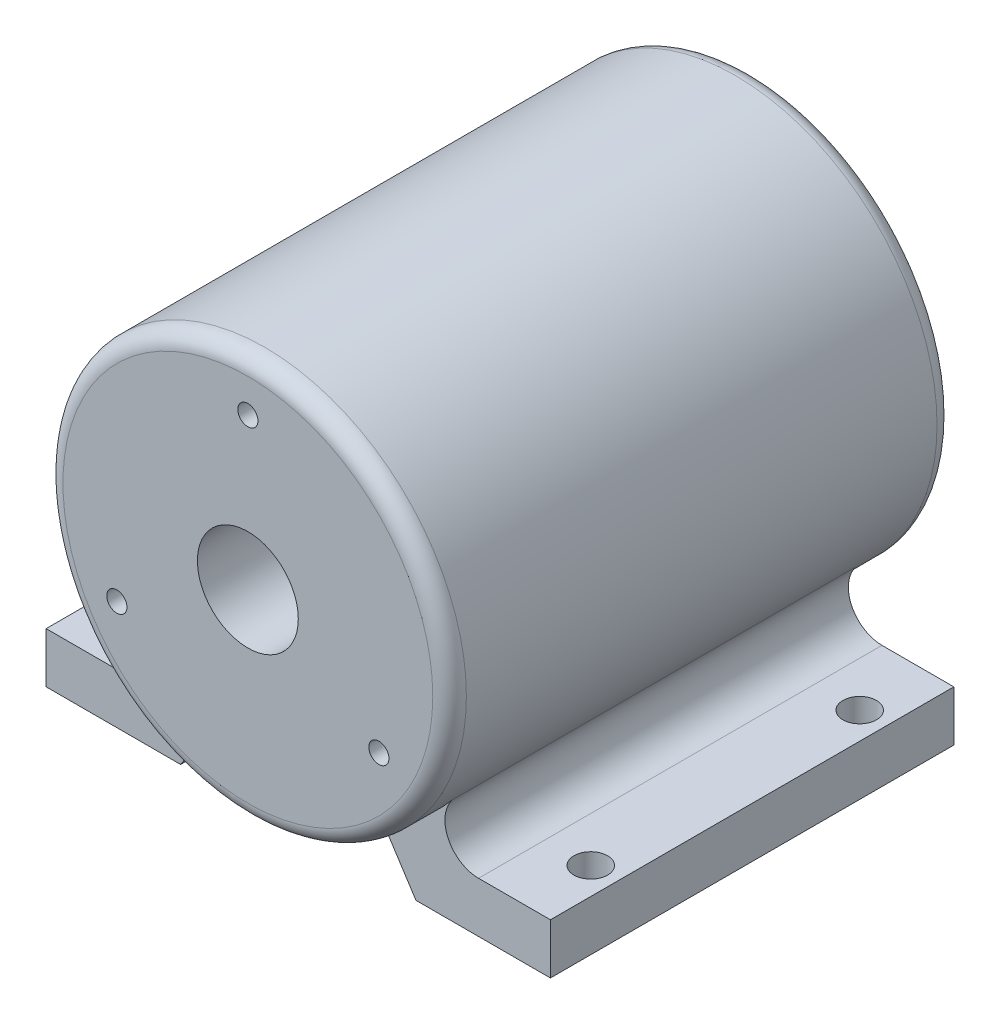
ISO-10303-21;
HEADER;
FILE_DESCRIPTION(('STEP AP214'),'2;1');
FILE_NAME('part.step','',(''),(''),'','','');
FILE_SCHEMA(('AUTOMOTIVE_DESIGN { 1 0 10303 214 1 1 1 1 }'));
ENDSEC;
DATA;
#1=APPLICATION_CONTEXT('core data for automotive mechanical design processes');
#2=APPLICATION_PROTOCOL_DEFINITION('international standard','automotive_design',2000,#1);
#3=PRODUCT_CONTEXT('',#1,'mechanical');
#4=PRODUCT('Part','Part','',(#3));
#5=PRODUCT_RELATED_PRODUCT_CATEGORY('part','',(#4));
#6=PRODUCT_DEFINITION_FORMATION('','',#4);
#7=PRODUCT_DEFINITION_CONTEXT('part definition',#1,'design');
#8=PRODUCT_DEFINITION('design','',#6,#7);
#9=PRODUCT_DEFINITION_SHAPE('','',#8);
#10=(LENGTH_UNIT() NAMED_UNIT(*) SI_UNIT(.MILLI.,.METRE.));
#11=(NAMED_UNIT(*) PLANE_ANGLE_UNIT() SI_UNIT($,.RADIAN.));
#12=(NAMED_UNIT(*) SI_UNIT($,.STERADIAN.) SOLID_ANGLE_UNIT());
#13=UNCERTAINTY_MEASURE_WITH_UNIT(LENGTH_MEASURE(1.E-05),#10,'distance_accuracy_value','');
#14=(GEOMETRIC_REPRESENTATION_CONTEXT(3) GLOBAL_UNCERTAINTY_ASSIGNED_CONTEXT((#13)) GLOBAL_UNIT_ASSIGNED_CONTEXT((#10,
#11,#12)) REPRESENTATION_CONTEXT('',''));
#15=CARTESIAN_POINT('',(0.,0.,0.));
#16=DIRECTION('',(0.,0.,1.));
#17=DIRECTION('',(1.,0.,0.));
#18=AXIS2_PLACEMENT_3D('',#15,#16,#17);
#19=CARTESIAN_POINT('',(0.,-5.5,13.5));
#20=DIRECTION('',(0.,-1.,0.));
#21=DIRECTION('',(1.,0.,0.));
#22=AXIS2_PLACEMENT_3D('',#19,#20,#21);
#23=PLANE('',#22);
#24=CARTESIAN_POINT('',(6.7,-5.5,11.5));
#25=DIRECTION('',(0.,1.,0.));
#26=DIRECTION('',(0.,0.,1.));
#27=AXIS2_PLACEMENT_3D('',#24,#25,#26);
#28=CIRCLE('',#27,0.5);
#29=CARTESIAN_POINT('',(6.7,-5.5,12.));
#30=VERTEX_POINT('',#29);
#31=EDGE_CURVE('E223',#30,#30,#28,.T.);
#32=ORIENTED_EDGE('',*,*,#31,.F.);
#33=EDGE_LOOP('',(#32));
#34=FACE_BOUND('',#33,.T.);
#35=DIRECTION('',(-1.,0.,0.));
#36=VECTOR('',#35,1.);
#37=CARTESIAN_POINT('',(0.,-5.5,1.5));
#38=LINE('',#37,#36);
#39=CARTESIAN_POINT('',(7.5,-5.5,1.5));
#40=VERTEX_POINT('',#39);
#41=CARTESIAN_POINT('',(5.36190264738181,-5.5,1.5));
#42=VERTEX_POINT('',#41);
#43=EDGE_CURVE('E254',#40,#42,#38,.T.);
#44=ORIENTED_EDGE('',*,*,#43,.T.);
#45=DIRECTION('',(0.,0.,-1.));
#46=VECTOR('',#45,1.);
#47=CARTESIAN_POINT('',(5.36190264738181,-5.5,13.5));
#48=LINE('',#47,#46);
#49=CARTESIAN_POINT('',(5.36190264738181,-5.5,13.5));
#50=VERTEX_POINT('',#49);
#51=EDGE_CURVE('E266',#50,#42,#48,.T.);
#52=ORIENTED_EDGE('',*,*,#51,.F.);
#53=DIRECTION('',(-1.,0.,0.));
#54=VECTOR('',#53,1.);
#55=CARTESIAN_POINT('',(0.,-5.5,13.5));
#56=LINE('',#55,#54);
#57=CARTESIAN_POINT('',(7.5,-5.5,13.5));
#58=VERTEX_POINT('',#57);
#59=EDGE_CURVE('E239',#58,#50,#56,.T.);
#60=ORIENTED_EDGE('',*,*,#59,.F.);
#61=DIRECTION('',(0.,0.,-1.));
#62=VECTOR('',#61,1.);
#63=CARTESIAN_POINT('',(7.5,-5.5,13.5));
#64=LINE('',#63,#62);
#65=EDGE_CURVE('E268',#58,#40,#64,.T.);
#66=ORIENTED_EDGE('',*,*,#65,.T.);
#67=EDGE_LOOP('',(#44,#52,#60,#66));
#68=FACE_BOUND('',#67,.T.);
#69=CARTESIAN_POINT('',(6.7,-5.5,3.5));
#70=DIRECTION('',(0.,1.,0.));
#71=DIRECTION('',(0.,0.,1.));
#72=AXIS2_PLACEMENT_3D('',#69,#70,#71);
#73=CIRCLE('',#72,0.5);
#74=CARTESIAN_POINT('',(6.7,-5.5,4.));
#75=VERTEX_POINT('',#74);
#76=EDGE_CURVE('E217',#75,#75,#73,.T.);
#77=ORIENTED_EDGE('',*,*,#76,.F.);
#78=EDGE_LOOP('',(#77));
#79=FACE_BOUND('',#78,.T.);
#80=ADVANCED_FACE('F37',(#34,#68,#79),#23,.F.);
#81=CARTESIAN_POINT('',(0.,0.,15.));
#82=DIRECTION('',(0.,0.,-1.));
#83=DIRECTION('',(-1.,0.,0.));
#84=AXIS2_PLACEMENT_3D('',#81,#82,#83);
#85=CYLINDRICAL_SURFACE('',#84,6.);
#86=DIRECTION('',(0.,0.,-1.));
#87=VECTOR('',#86,1.);
#88=CARTESIAN_POINT('',(-4.59591655489869,-3.85714285714285,13.5));
#89=LINE('',#88,#87);
#90=CARTESIAN_POINT('',(-4.59591655489869,-3.85714285714285,13.5));
#91=VERTEX_POINT('',#90);
#92=CARTESIAN_POINT('',(-4.59591655489869,-3.85714285714285,1.5));
#93=VERTEX_POINT('',#92);
#94=EDGE_CURVE('E57',#91,#93,#89,.T.);
#95=ORIENTED_EDGE('',*,*,#94,.F.);
#96=CARTESIAN_POINT('',(0.,0.,13.5));
#97=DIRECTION('',(0.,0.,-1.));
#98=DIRECTION('',(-1.,0.,0.));
#99=AXIS2_PLACEMENT_3D('',#96,#97,#98);
#100=CIRCLE('',#99,6.);
#101=CARTESIAN_POINT('',(-2.5,-5.45435605731786,13.5));
#102=VERTEX_POINT('',#101);
#103=EDGE_CURVE('E52',#102,#91,#100,.T.);
#104=ORIENTED_EDGE('',*,*,#103,.F.);
#105=DIRECTION('',(0.,0.,-1.));
#106=VECTOR('',#105,1.);
#107=CARTESIAN_POINT('',(-2.5,-5.45435605731786,13.5));
#108=LINE('',#107,#106);
#109=CARTESIAN_POINT('',(-2.5,-5.45435605731786,1.5));
#110=VERTEX_POINT('',#109);
#111=EDGE_CURVE('E215',#102,#110,#108,.T.);
#112=ORIENTED_EDGE('',*,*,#111,.T.);
#113=CARTESIAN_POINT('',(0.,0.,1.5));
#114=DIRECTION('',(0.,0.,-1.));
#115=DIRECTION('',(-1.,0.,0.));
#116=AXIS2_PLACEMENT_3D('',#113,#114,#115);
#117=CIRCLE('',#116,6.);
#118=EDGE_CURVE('E194',#110,#93,#117,.T.);
#119=ORIENTED_EDGE('',*,*,#118,.T.);
#120=EDGE_LOOP('',(#95,#104,#112,#119));
#121=FACE_BOUND('',#120,.T.);
#122=DIRECTION('',(0.,0.,-1.));
#123=VECTOR('',#122,1.);
#124=CARTESIAN_POINT('',(2.5,-5.45435605731786,13.5));
#125=LINE('',#124,#123);
#126=CARTESIAN_POINT('',(2.5,-5.45435605731786,13.5));
#127=VERTEX_POINT('',#126);
#128=CARTESIAN_POINT('',(2.5,-5.45435605731786,1.5));
#129=VERTEX_POINT('',#128);
#130=EDGE_CURVE('E246',#127,#129,#125,.T.);
#131=ORIENTED_EDGE('',*,*,#130,.F.);
#132=CARTESIAN_POINT('',(0.,0.,13.5));
#133=DIRECTION('',(0.,0.,1.));
#134=DIRECTION('',(1.,0.,0.));
#135=AXIS2_PLACEMENT_3D('',#132,#133,#134);
#136=CIRCLE('',#135,6.);
#137=CARTESIAN_POINT('',(4.59591655489869,-3.85714285714285,13.5));
#138=VERTEX_POINT('',#137);
#139=EDGE_CURVE('E244',#127,#138,#136,.T.);
#140=ORIENTED_EDGE('',*,*,#139,.T.);
#141=DIRECTION('',(0.,0.,-1.));
#142=VECTOR('',#141,1.);
#143=CARTESIAN_POINT('',(4.59591655489869,-3.85714285714285,13.5));
#144=LINE('',#143,#142);
#145=CARTESIAN_POINT('',(4.59591655489869,-3.85714285714285,1.5));
#146=VERTEX_POINT('',#145);
#147=EDGE_CURVE('E264',#138,#146,#144,.T.);
#148=ORIENTED_EDGE('',*,*,#147,.T.);
#149=CARTESIAN_POINT('',(0.,0.,1.5));
#150=DIRECTION('',(0.,0.,1.));
#151=DIRECTION('',(1.,0.,0.));
#152=AXIS2_PLACEMENT_3D('',#149,#150,#151);
#153=CIRCLE('',#152,6.);
#154=EDGE_CURVE('E234',#129,#146,#153,.T.);
#155=ORIENTED_EDGE('',*,*,#154,.F.);
#156=EDGE_LOOP('',(#131,#140,#148,#155));
#157=FACE_BOUND('',#156,.T.);
#158=CARTESIAN_POINT('',(0.,0.,14.5));
#159=DIRECTION('',(0.,0.,1.));
#160=DIRECTION('',(1.,0.,0.));
#161=AXIS2_PLACEMENT_3D('',#158,#159,#160);
#162=CIRCLE('',#161,6.);
#163=CARTESIAN_POINT('',(6.,0.,14.5));
#164=VERTEX_POINT('',#163);
#165=EDGE_CURVE('E281',#164,#164,#162,.F.);
#166=ORIENTED_EDGE('',*,*,#165,.T.);
#167=EDGE_LOOP('',(#166));
#168=FACE_BOUND('',#167,.T.);
#169=CARTESIAN_POINT('',(0.,0.,0.5));
#170=DIRECTION('',(0.,0.,1.));
#171=DIRECTION('',(1.,0.,0.));
#172=AXIS2_PLACEMENT_3D('',#169,#170,#171);
#173=CIRCLE('',#172,6.);
#174=CARTESIAN_POINT('',(6.,0.,0.5));
#175=VERTEX_POINT('',#174);
#176=EDGE_CURVE('E278',#175,#175,#173,.T.);
#177=ORIENTED_EDGE('',*,*,#176,.T.);
#178=EDGE_LOOP('',(#177));
#179=FACE_BOUND('',#178,.T.);
#180=ADVANCED_FACE('F328',(#121,#157,#168,#179),#85,.T.);
#181=CARTESIAN_POINT('',(0.,0.,15.));
#182=DIRECTION('',(0.,0.,1.));
#183=DIRECTION('',(1.,0.,0.));
#184=AXIS2_PLACEMENT_3D('',#181,#182,#183);
#185=PLANE('',#184);
#186=CARTESIAN_POINT('',(0.,4.5,15.));
#187=DIRECTION('',(0.,0.,1.));
#188=DIRECTION('',(1.,0.,0.));
#189=AXIS2_PLACEMENT_3D('',#186,#187,#188);
#190=CIRCLE('',#189,0.299999999999989);
#191=CARTESIAN_POINT('',(0.299999999999989,4.5,15.));
#192=VERTEX_POINT('',#191);
#193=EDGE_CURVE('E142',#192,#192,#190,.T.);
#194=ORIENTED_EDGE('',*,*,#193,.F.);
#195=EDGE_LOOP('',(#194));
#196=FACE_BOUND('',#195,.T.);
#197=CARTESIAN_POINT('',(3.89711431702997,-2.25,15.));
#198=DIRECTION('',(0.,0.,1.));
#199=DIRECTION('',(1.,0.,0.));
#200=AXIS2_PLACEMENT_3D('',#197,#198,#199);
#201=CIRCLE('',#200,0.299999999999989);
#202=CARTESIAN_POINT('',(4.19711431702996,-2.25,15.));
#203=VERTEX_POINT('',#202);
#204=EDGE_CURVE('E141',#203,#203,#201,.T.);
#205=ORIENTED_EDGE('',*,*,#204,.F.);
#206=EDGE_LOOP('',(#205));
#207=FACE_BOUND('',#206,.T.);
#208=CARTESIAN_POINT('',(-3.89711431702997,-2.25,15.));
#209=DIRECTION('',(0.,0.,1.));
#210=DIRECTION('',(1.,0.,0.));
#211=AXIS2_PLACEMENT_3D('',#208,#209,#210);
#212=CIRCLE('',#211,0.299999999999989);
#213=CARTESIAN_POINT('',(-3.59711431702998,-2.25,15.));
#214=VERTEX_POINT('',#213);
#215=EDGE_CURVE('E152',#214,#214,#212,.T.);
#216=ORIENTED_EDGE('',*,*,#215,.F.);
#217=EDGE_LOOP('',(#216));
#218=FACE_BOUND('',#217,.T.);
#219=CARTESIAN_POINT('',(0.,0.,15.));
#220=DIRECTION('',(0.,0.,1.));
#221=DIRECTION('',(1.,0.,0.));
#222=AXIS2_PLACEMENT_3D('',#219,#220,#221);
#223=CIRCLE('',#222,1.5);
#224=CARTESIAN_POINT('',(1.5,0.,15.));
#225=VERTEX_POINT('',#224);
#226=EDGE_CURVE('E158',#225,#225,#223,.T.);
#227=ORIENTED_EDGE('',*,*,#226,.F.);
#228=EDGE_LOOP('',(#227));
#229=FACE_BOUND('',#228,.T.);
#230=CARTESIAN_POINT('',(0.,0.,15.));
#231=DIRECTION('',(0.,0.,1.));
#232=DIRECTION('',(1.,0.,0.));
#233=AXIS2_PLACEMENT_3D('',#230,#231,#232);
#234=CIRCLE('',#233,5.5);
#235=CARTESIAN_POINT('',(5.5,0.,15.));
#236=VERTEX_POINT('',#235);
#237=EDGE_CURVE('E275',#236,#236,#234,.T.);
#238=ORIENTED_EDGE('',*,*,#237,.T.);
#239=EDGE_LOOP('',(#238));
#240=FACE_BOUND('',#239,.T.);
#241=ADVANCED_FACE('F334',(#196,#207,#218,#229,#240),#185,.T.);
#242=CARTESIAN_POINT('',(0.,0.,0.));
#243=DIRECTION('',(0.,0.,1.));
#244=DIRECTION('',(1.,0.,0.));
#245=AXIS2_PLACEMENT_3D('',#242,#243,#244);
#246=PLANE('',#245);
#247=CARTESIAN_POINT('',(0.,0.,0.));
#248=DIRECTION('',(0.,0.,1.));
#249=DIRECTION('',(1.,0.,0.));
#250=AXIS2_PLACEMENT_3D('',#247,#248,#249);
#251=CIRCLE('',#250,4.2);
#252=CARTESIAN_POINT('',(4.2,0.,0.));
#253=VERTEX_POINT('',#252);
#254=EDGE_CURVE('E45',#253,#253,#251,.T.);
#255=ORIENTED_EDGE('',*,*,#254,.T.);
#256=EDGE_LOOP('',(#255));
#257=FACE_BOUND('',#256,.T.);
#258=CARTESIAN_POINT('',(0.,0.,0.));
#259=DIRECTION('',(0.,0.,1.));
#260=DIRECTION('',(1.,0.,0.));
#261=AXIS2_PLACEMENT_3D('',#258,#259,#260);
#262=CIRCLE('',#261,5.5);
#263=CARTESIAN_POINT('',(5.5,0.,0.));
#264=VERTEX_POINT('',#263);
#265=EDGE_CURVE('E284',#264,#264,#262,.F.);
#266=ORIENTED_EDGE('',*,*,#265,.T.);
#267=EDGE_LOOP('',(#266));
#268=FACE_BOUND('',#267,.T.);
#269=ADVANCED_FACE('F295',(#257,#268),#246,.F.);
#270=CARTESIAN_POINT('',(0.,0.,-1.));
#271=DIRECTION('',(0.,0.,1.));
#272=DIRECTION('',(1.,0.,0.));
#273=AXIS2_PLACEMENT_3D('',#270,#271,#272);
#274=CYLINDRICAL_SURFACE('',#273,4.);
#275=CARTESIAN_POINT('',(0.,0.,-0.2));
#276=DIRECTION('',(0.,0.,1.));
#277=DIRECTION('',(1.,0.,0.));
#278=AXIS2_PLACEMENT_3D('',#275,#276,#277);
#279=CIRCLE('',#278,4.);
#280=CARTESIAN_POINT('',(4.,0.,-0.2));
#281=VERTEX_POINT('',#280);
#282=EDGE_CURVE('E290',#281,#281,#279,.F.);
#283=ORIENTED_EDGE('',*,*,#282,.T.);
#284=EDGE_LOOP('',(#283));
#285=FACE_BOUND('',#284,.T.);
#286=CARTESIAN_POINT('',(0.,0.,-0.8));
#287=DIRECTION('',(0.,0.,-1.));
#288=DIRECTION('',(-1.,0.,0.));
#289=AXIS2_PLACEMENT_3D('',#286,#287,#288);
#290=CIRCLE('',#289,4.);
#291=CARTESIAN_POINT('',(-4.,0.,-0.8));
#292=VERTEX_POINT('',#291);
#293=EDGE_CURVE('E287',#292,#292,#290,.F.);
#294=ORIENTED_EDGE('',*,*,#293,.T.);
#295=EDGE_LOOP('',(#294));
#296=FACE_BOUND('',#295,.T.);
#297=ADVANCED_FACE('F304',(#285,#296),#274,.T.);
#298=CARTESIAN_POINT('',(0.,0.,-1.));
#299=DIRECTION('',(0.,0.,-1.));
#300=DIRECTION('',(-1.,0.,0.));
#301=AXIS2_PLACEMENT_3D('',#298,#299,#300);
#302=PLANE('',#301);
#303=CARTESIAN_POINT('',(0.,0.,-1.));
#304=DIRECTION('',(0.,0.,1.));
#305=DIRECTION('',(1.,0.,0.));
#306=AXIS2_PLACEMENT_3D('',#303,#304,#305);
#307=CIRCLE('',#306,1.5);
#308=CARTESIAN_POINT('',(1.5,0.,-1.));
#309=VERTEX_POINT('',#308);
#310=EDGE_CURVE('E159',#309,#309,#307,.T.);
#311=ORIENTED_EDGE('',*,*,#310,.T.);
#312=EDGE_LOOP('',(#311));
#313=FACE_BOUND('',#312,.T.);
#314=CARTESIAN_POINT('',(0.,0.,-1.));
#315=DIRECTION('',(0.,0.,-1.));
#316=DIRECTION('',(-1.,0.,0.));
#317=AXIS2_PLACEMENT_3D('',#314,#315,#316);
#318=CIRCLE('',#317,3.8);
#319=CARTESIAN_POINT('',(-3.8,0.,-1.));
#320=VERTEX_POINT('',#319);
#321=EDGE_CURVE('E11',#320,#320,#318,.T.);
#322=ORIENTED_EDGE('',*,*,#321,.T.);
#323=EDGE_LOOP('',(#322));
#324=FACE_BOUND('',#323,.T.);
#325=ADVANCED_FACE('F307',(#313,#324),#302,.T.);
#326=CARTESIAN_POINT('',(0.,0.,14.5));
#327=DIRECTION('',(0.,0.,1.));
#328=DIRECTION('',(1.,0.,0.));
#329=AXIS2_PLACEMENT_3D('',#326,#327,#328);
#330=TOROIDAL_SURFACE('',#329,5.5,0.5);
#331=ORIENTED_EDGE('',*,*,#165,.F.);
#332=EDGE_LOOP('',(#331));
#333=FACE_BOUND('',#332,.T.);
#334=ORIENTED_EDGE('',*,*,#237,.F.);
#335=EDGE_LOOP('',(#334));
#336=FACE_BOUND('',#335,.T.);
#337=ADVANCED_FACE('F317',(#333,#336),#330,.T.);
#338=CARTESIAN_POINT('',(0.,0.,0.5));
#339=DIRECTION('',(0.,0.,1.));
#340=DIRECTION('',(1.,0.,0.));
#341=AXIS2_PLACEMENT_3D('',#338,#339,#340);
#342=TOROIDAL_SURFACE('',#341,5.5,0.5);
#343=ORIENTED_EDGE('',*,*,#265,.F.);
#344=EDGE_LOOP('',(#343));
#345=FACE_BOUND('',#344,.T.);
#346=ORIENTED_EDGE('',*,*,#176,.F.);
#347=EDGE_LOOP('',(#346));
#348=FACE_BOUND('',#347,.T.);
#349=ADVANCED_FACE('F323',(#345,#348),#342,.T.);
#350=CARTESIAN_POINT('',(-0.725270989969868,-0.469235488162502,13.5));
#351=DIRECTION('',(-0.839600518399933,-0.543204353353841,0.));
#352=DIRECTION('',(0.543204353353841,-0.839600518399933,0.));
#353=AXIS2_PLACEMENT_3D('',#350,#351,#352);
#354=PLANE('',#353);
#355=DIRECTION('',(-0.543204353353841,0.839600518399933,0.));
#356=VECTOR('',#355,1.);
#357=CARTESIAN_POINT('',(-0.725270989969868,-0.469235488162502,1.5));
#358=LINE('',#357,#356);
#359=CARTESIAN_POINT('',(3.5,-7.,1.5));
#360=VERTEX_POINT('',#359);
#361=EDGE_CURVE('E229',#360,#129,#358,.T.);
#362=ORIENTED_EDGE('',*,*,#361,.F.);
#363=DIRECTION('',(0.,0.,-1.));
#364=VECTOR('',#363,1.);
#365=CARTESIAN_POINT('',(3.5,-7.,13.5));
#366=LINE('',#365,#364);
#367=CARTESIAN_POINT('',(3.5,-7.,13.5));
#368=VERTEX_POINT('',#367);
#369=EDGE_CURVE('E273',#368,#360,#366,.T.);
#370=ORIENTED_EDGE('',*,*,#369,.F.);
#371=DIRECTION('',(-0.543204353353841,0.839600518399933,0.));
#372=VECTOR('',#371,1.);
#373=CARTESIAN_POINT('',(-0.725270989969868,-0.469235488162502,13.5));
#374=LINE('',#373,#372);
#375=EDGE_CURVE('E230',#368,#127,#374,.T.);
#376=ORIENTED_EDGE('',*,*,#375,.T.);
#377=ORIENTED_EDGE('',*,*,#130,.T.);
#378=EDGE_LOOP('',(#362,#370,#376,#377));
#379=FACE_BOUND('',#378,.T.);
#380=ADVANCED_FACE('F348',(#379),#354,.T.);
#381=CARTESIAN_POINT('',(0.,-7.,13.5));
#382=DIRECTION('',(0.,-1.,0.));
#383=DIRECTION('',(1.,0.,0.));
#384=AXIS2_PLACEMENT_3D('',#381,#382,#383);
#385=PLANE('',#384);
#386=CARTESIAN_POINT('',(6.7,-7.,3.5));
#387=DIRECTION('',(0.,1.,0.));
#388=DIRECTION('',(0.,0.,1.));
#389=AXIS2_PLACEMENT_3D('',#386,#387,#388);
#390=CIRCLE('',#389,0.5);
#391=CARTESIAN_POINT('',(6.7,-7.,4.));
#392=VERTEX_POINT('',#391);
#393=EDGE_CURVE('E220',#392,#392,#390,.T.);
#394=ORIENTED_EDGE('',*,*,#393,.T.);
#395=EDGE_LOOP('',(#394));
#396=FACE_BOUND('',#395,.T.);
#397=CARTESIAN_POINT('',(6.7,-7.,11.5));
#398=DIRECTION('',(0.,1.,0.));
#399=DIRECTION('',(0.,0.,1.));
#400=AXIS2_PLACEMENT_3D('',#397,#398,#399);
#401=CIRCLE('',#400,0.5);
#402=CARTESIAN_POINT('',(6.7,-7.,12.));
#403=VERTEX_POINT('',#402);
#404=EDGE_CURVE('E226',#403,#403,#401,.T.);
#405=ORIENTED_EDGE('',*,*,#404,.T.);
#406=EDGE_LOOP('',(#405));
#407=FACE_BOUND('',#406,.T.);
#408=DIRECTION('',(-1.,0.,0.));
#409=VECTOR('',#408,1.);
#410=CARTESIAN_POINT('',(0.,-7.,1.5));
#411=LINE('',#410,#409);
#412=CARTESIAN_POINT('',(7.5,-7.,1.5));
#413=VERTEX_POINT('',#412);
#414=EDGE_CURVE('E249',#413,#360,#411,.T.);
#415=ORIENTED_EDGE('',*,*,#414,.F.);
#416=DIRECTION('',(0.,0.,-1.));
#417=VECTOR('',#416,1.);
#418=CARTESIAN_POINT('',(7.5,-7.,13.5));
#419=LINE('',#418,#417);
#420=CARTESIAN_POINT('',(7.5,-7.,13.5));
#421=VERTEX_POINT('',#420);
#422=EDGE_CURVE('E271',#421,#413,#419,.T.);
#423=ORIENTED_EDGE('',*,*,#422,.F.);
#424=DIRECTION('',(-1.,0.,0.));
#425=VECTOR('',#424,1.);
#426=CARTESIAN_POINT('',(0.,-7.,13.5));
#427=LINE('',#426,#425);
#428=EDGE_CURVE('E233',#421,#368,#427,.T.);
#429=ORIENTED_EDGE('',*,*,#428,.T.);
#430=ORIENTED_EDGE('',*,*,#369,.T.);
#431=EDGE_LOOP('',(#415,#423,#429,#430));
#432=FACE_BOUND('',#431,.T.);
#433=ADVANCED_FACE('F345',(#396,#407,#432),#385,.T.);
#434=CARTESIAN_POINT('',(7.5,0.,13.5));
#435=DIRECTION('',(-1.,0.,0.));
#436=DIRECTION('',(0.,0.,1.));
#437=AXIS2_PLACEMENT_3D('',#434,#435,#436);
#438=PLANE('',#437);
#439=DIRECTION('',(0.,1.,0.));
#440=VECTOR('',#439,1.);
#441=CARTESIAN_POINT('',(7.5,0.,1.5));
#442=LINE('',#441,#440);
#443=EDGE_CURVE('E252',#413,#40,#442,.T.);
#444=ORIENTED_EDGE('',*,*,#443,.T.);
#445=ORIENTED_EDGE('',*,*,#65,.F.);
#446=DIRECTION('',(0.,1.,0.));
#447=VECTOR('',#446,1.);
#448=CARTESIAN_POINT('',(7.5,0.,13.5));
#449=LINE('',#448,#447);
#450=EDGE_CURVE('E237',#421,#58,#449,.T.);
#451=ORIENTED_EDGE('',*,*,#450,.F.);
#452=ORIENTED_EDGE('',*,*,#422,.T.);
#453=EDGE_LOOP('',(#444,#445,#451,#452));
#454=FACE_BOUND('',#453,.T.);
#455=ADVANCED_FACE('F342',(#454),#438,.F.);
#456=CARTESIAN_POINT('',(5.36190264738181,-4.5,13.5));
#457=DIRECTION('',(0.,0.,-1.));
#458=DIRECTION('',(-1.,0.,0.));
#459=AXIS2_PLACEMENT_3D('',#456,#457,#458);
#460=CYLINDRICAL_SURFACE('',#459,1.);
#461=CARTESIAN_POINT('',(5.36190264738181,-4.5,1.5));
#462=DIRECTION('',(0.,0.,1.));
#463=DIRECTION('',(1.,0.,0.));
#464=AXIS2_PLACEMENT_3D('',#461,#462,#463);
#465=CIRCLE('',#464,1.);
#466=EDGE_CURVE('E257',#146,#42,#465,.T.);
#467=ORIENTED_EDGE('',*,*,#466,.F.);
#468=ORIENTED_EDGE('',*,*,#147,.F.);
#469=CARTESIAN_POINT('',(5.36190264738181,-4.5,13.5));
#470=DIRECTION('',(0.,0.,1.));
#471=DIRECTION('',(1.,0.,0.));
#472=AXIS2_PLACEMENT_3D('',#469,#470,#471);
#473=CIRCLE('',#472,1.);
#474=EDGE_CURVE('E241',#138,#50,#473,.T.);
#475=ORIENTED_EDGE('',*,*,#474,.T.);
#476=ORIENTED_EDGE('',*,*,#51,.T.);
#477=EDGE_LOOP('',(#467,#468,#475,#476));
#478=FACE_BOUND('',#477,.T.);
#479=ADVANCED_FACE('F340',(#478),#460,.F.);
#480=CARTESIAN_POINT('',(0.,0.,13.5));
#481=DIRECTION('',(0.,0.,1.));
#482=DIRECTION('',(1.,0.,0.));
#483=AXIS2_PLACEMENT_3D('',#480,#481,#482);
#484=PLANE('',#483);
#485=ORIENTED_EDGE('',*,*,#375,.F.);
#486=ORIENTED_EDGE('',*,*,#428,.F.);
#487=ORIENTED_EDGE('',*,*,#450,.T.);
#488=ORIENTED_EDGE('',*,*,#59,.T.);
#489=ORIENTED_EDGE('',*,*,#474,.F.);
#490=ORIENTED_EDGE('',*,*,#139,.F.);
#491=EDGE_LOOP('',(#485,#486,#487,#488,#489,#490));
#492=FACE_BOUND('',#491,.T.);
#493=ADVANCED_FACE('F368',(#492),#484,.T.);
#494=CARTESIAN_POINT('',(0.,0.,1.5));
#495=DIRECTION('',(0.,0.,1.));
#496=DIRECTION('',(1.,0.,0.));
#497=AXIS2_PLACEMENT_3D('',#494,#495,#496);
#498=PLANE('',#497);
#499=ORIENTED_EDGE('',*,*,#361,.T.);
#500=ORIENTED_EDGE('',*,*,#154,.T.);
#501=ORIENTED_EDGE('',*,*,#466,.T.);
#502=ORIENTED_EDGE('',*,*,#43,.F.);
#503=ORIENTED_EDGE('',*,*,#443,.F.);
#504=ORIENTED_EDGE('',*,*,#414,.T.);
#505=EDGE_LOOP('',(#499,#500,#501,#502,#503,#504));
#506=FACE_BOUND('',#505,.T.);
#507=ADVANCED_FACE('F362',(#506),#498,.F.);
#508=CARTESIAN_POINT('',(6.7,-5.5,11.5));
#509=DIRECTION('',(0.,1.,0.));
#510=DIRECTION('',(0.,0.,1.));
#511=AXIS2_PLACEMENT_3D('',#508,#509,#510);
#512=CYLINDRICAL_SURFACE('',#511,0.5);
#513=ORIENTED_EDGE('',*,*,#404,.F.);
#514=EDGE_LOOP('',(#513));
#515=FACE_BOUND('',#514,.T.);
#516=ORIENTED_EDGE('',*,*,#31,.T.);
#517=EDGE_LOOP('',(#516));
#518=FACE_BOUND('',#517,.T.);
#519=ADVANCED_FACE('F385',(#515,#518),#512,.F.);
#520=CARTESIAN_POINT('',(6.7,-5.5,3.5));
#521=DIRECTION('',(0.,1.,0.));
#522=DIRECTION('',(0.,0.,1.));
#523=AXIS2_PLACEMENT_3D('',#520,#521,#522);
#524=CYLINDRICAL_SURFACE('',#523,0.5);
#525=ORIENTED_EDGE('',*,*,#393,.F.);
#526=EDGE_LOOP('',(#525));
#527=FACE_BOUND('',#526,.T.);
#528=ORIENTED_EDGE('',*,*,#76,.T.);
#529=EDGE_LOOP('',(#528));
#530=FACE_BOUND('',#529,.T.);
#531=ADVANCED_FACE('F382',(#527,#530),#524,.F.);
#532=CARTESIAN_POINT('',(0.725270989969868,-0.469235488162502,13.5));
#533=DIRECTION('',(-0.839600518399933,0.543204353353841,0.));
#534=DIRECTION('',(-0.543204353353841,-0.839600518399933,0.));
#535=AXIS2_PLACEMENT_3D('',#532,#533,#534);
#536=PLANE('',#535);
#537=DIRECTION('',(0.543204353353841,0.839600518399933,0.));
#538=VECTOR('',#537,1.);
#539=CARTESIAN_POINT('',(0.725270989969868,-0.469235488162502,1.5));
#540=LINE('',#539,#538);
#541=CARTESIAN_POINT('',(-3.5,-7.,1.5));
#542=VERTEX_POINT('',#541);
#543=EDGE_CURVE('E176',#542,#110,#540,.T.);
#544=ORIENTED_EDGE('',*,*,#543,.T.);
#545=ORIENTED_EDGE('',*,*,#111,.F.);
#546=DIRECTION('',(0.543204353353841,0.839600518399933,0.));
#547=VECTOR('',#546,1.);
#548=CARTESIAN_POINT('',(0.725270989969868,-0.469235488162502,13.5));
#549=LINE('',#548,#547);
#550=CARTESIAN_POINT('',(-3.5,-7.,13.5));
#551=VERTEX_POINT('',#550);
#552=EDGE_CURVE('E177',#551,#102,#549,.T.);
#553=ORIENTED_EDGE('',*,*,#552,.F.);
#554=DIRECTION('',(0.,0.,-1.));
#555=VECTOR('',#554,1.);
#556=CARTESIAN_POINT('',(-3.5,-7.,13.5));
#557=LINE('',#556,#555);
#558=EDGE_CURVE('E191',#551,#542,#557,.T.);
#559=ORIENTED_EDGE('',*,*,#558,.T.);
#560=EDGE_LOOP('',(#544,#545,#553,#559));
#561=FACE_BOUND('',#560,.T.);
#562=ADVANCED_FACE('F384',(#561),#536,.F.);
#563=CARTESIAN_POINT('',(-5.36190264738181,-4.5,13.5));
#564=DIRECTION('',(0.,0.,-1.));
#565=DIRECTION('',(-1.,0.,0.));
#566=AXIS2_PLACEMENT_3D('',#563,#564,#565);
#567=CYLINDRICAL_SURFACE('',#566,1.);
#568=CARTESIAN_POINT('',(-5.36190264738181,-4.5,1.5));
#569=DIRECTION('',(0.,0.,-1.));
#570=DIRECTION('',(-1.,0.,0.));
#571=AXIS2_PLACEMENT_3D('',#568,#569,#570);
#572=CIRCLE('',#571,1.);
#573=CARTESIAN_POINT('',(-5.36190264738181,-5.5,1.5));
#574=VERTEX_POINT('',#573);
#575=EDGE_CURVE('E196',#93,#574,#572,.T.);
#576=ORIENTED_EDGE('',*,*,#575,.T.);
#577=DIRECTION('',(0.,0.,-1.));
#578=VECTOR('',#577,1.);
#579=CARTESIAN_POINT('',(-5.36190264738181,-5.5,13.5));
#580=LINE('',#579,#578);
#581=CARTESIAN_POINT('',(-5.36190264738181,-5.5,13.5));
#582=VERTEX_POINT('',#581);
#583=EDGE_CURVE('E212',#582,#574,#580,.T.);
#584=ORIENTED_EDGE('',*,*,#583,.F.);
#585=CARTESIAN_POINT('',(-5.36190264738181,-4.5,13.5));
#586=DIRECTION('',(0.,0.,-1.));
#587=DIRECTION('',(-1.,0.,0.));
#588=AXIS2_PLACEMENT_3D('',#585,#586,#587);
#589=CIRCLE('',#588,1.);
#590=EDGE_CURVE('E181',#91,#582,#589,.T.);
#591=ORIENTED_EDGE('',*,*,#590,.F.);
#592=ORIENTED_EDGE('',*,*,#94,.T.);
#593=EDGE_LOOP('',(#576,#584,#591,#592));
#594=FACE_BOUND('',#593,.T.);
#595=ADVANCED_FACE('F392',(#594),#567,.F.);
#596=CARTESIAN_POINT('',(0.,-5.5,13.5));
#597=DIRECTION('',(0.,1.,0.));
#598=DIRECTION('',(-1.,0.,0.));
#599=AXIS2_PLACEMENT_3D('',#596,#597,#598);
#600=PLANE('',#599);
#601=CARTESIAN_POINT('',(-6.7,-5.5,3.5));
#602=DIRECTION('',(0.,1.,0.));
#603=DIRECTION('',(0.,0.,1.));
#604=AXIS2_PLACEMENT_3D('',#601,#602,#603);
#605=CIRCLE('',#604,0.5);
#606=CARTESIAN_POINT('',(-6.7,-5.5,4.));
#607=VERTEX_POINT('',#606);
#608=EDGE_CURVE('E162',#607,#607,#605,.T.);
#609=ORIENTED_EDGE('',*,*,#608,.F.);
#610=EDGE_LOOP('',(#609));
#611=FACE_BOUND('',#610,.T.);
#612=CARTESIAN_POINT('',(-6.7,-5.5,11.5));
#613=DIRECTION('',(0.,1.,0.));
#614=DIRECTION('',(0.,0.,1.));
#615=AXIS2_PLACEMENT_3D('',#612,#613,#614);
#616=CIRCLE('',#615,0.5);
#617=CARTESIAN_POINT('',(-6.7,-5.5,12.));
#618=VERTEX_POINT('',#617);
#619=EDGE_CURVE('E170',#618,#618,#616,.T.);
#620=ORIENTED_EDGE('',*,*,#619,.F.);
#621=EDGE_LOOP('',(#620));
#622=FACE_BOUND('',#621,.T.);
#623=DIRECTION('',(1.,0.,0.));
#624=VECTOR('',#623,1.);
#625=CARTESIAN_POINT('',(0.,-5.5,1.5));
#626=LINE('',#625,#624);
#627=CARTESIAN_POINT('',(-7.5,-5.5,1.5));
#628=VERTEX_POINT('',#627);
#629=EDGE_CURVE('E199',#628,#574,#626,.T.);
#630=ORIENTED_EDGE('',*,*,#629,.F.);
#631=DIRECTION('',(0.,0.,-1.));
#632=VECTOR('',#631,1.);
#633=CARTESIAN_POINT('',(-7.5,-5.5,13.5));
#634=LINE('',#633,#632);
#635=CARTESIAN_POINT('',(-7.5,-5.5,13.5));
#636=VERTEX_POINT('',#635);
#637=EDGE_CURVE('E210',#636,#628,#634,.T.);
#638=ORIENTED_EDGE('',*,*,#637,.F.);
#639=DIRECTION('',(1.,0.,0.));
#640=VECTOR('',#639,1.);
#641=CARTESIAN_POINT('',(0.,-5.5,13.5));
#642=LINE('',#641,#640);
#643=EDGE_CURVE('E183',#636,#582,#642,.T.);
#644=ORIENTED_EDGE('',*,*,#643,.T.);
#645=ORIENTED_EDGE('',*,*,#583,.T.);
#646=EDGE_LOOP('',(#630,#638,#644,#645));
#647=FACE_BOUND('',#646,.T.);
#648=ADVANCED_FACE('F442',(#611,#622,#647),#600,.T.);
#649=CARTESIAN_POINT('',(-7.5,0.,13.5));
#650=DIRECTION('',(-1.,0.,0.));
#651=DIRECTION('',(0.,0.,1.));
#652=AXIS2_PLACEMENT_3D('',#649,#650,#651);
#653=PLANE('',#652);
#654=DIRECTION('',(0.,1.,0.));
#655=VECTOR('',#654,1.);
#656=CARTESIAN_POINT('',(-7.5,0.,1.5));
#657=LINE('',#656,#655);
#658=CARTESIAN_POINT('',(-7.5,-7.,1.5));
#659=VERTEX_POINT('',#658);
#660=EDGE_CURVE('E202',#659,#628,#657,.T.);
#661=ORIENTED_EDGE('',*,*,#660,.F.);
#662=DIRECTION('',(0.,0.,-1.));
#663=VECTOR('',#662,1.);
#664=CARTESIAN_POINT('',(-7.5,-7.,13.5));
#665=LINE('',#664,#663);
#666=CARTESIAN_POINT('',(-7.5,-7.,13.5));
#667=VERTEX_POINT('',#666);
#668=EDGE_CURVE('E208',#667,#659,#665,.T.);
#669=ORIENTED_EDGE('',*,*,#668,.F.);
#670=DIRECTION('',(0.,1.,0.));
#671=VECTOR('',#670,1.);
#672=CARTESIAN_POINT('',(-7.5,0.,13.5));
#673=LINE('',#672,#671);
#674=EDGE_CURVE('E186',#667,#636,#673,.T.);
#675=ORIENTED_EDGE('',*,*,#674,.T.);
#676=ORIENTED_EDGE('',*,*,#637,.T.);
#677=EDGE_LOOP('',(#661,#669,#675,#676));
#678=FACE_BOUND('',#677,.T.);
#679=ADVANCED_FACE('F451',(#678),#653,.T.);
#680=CARTESIAN_POINT('',(0.,-7.,13.5));
#681=DIRECTION('',(0.,1.,0.));
#682=DIRECTION('',(-1.,0.,0.));
#683=AXIS2_PLACEMENT_3D('',#680,#681,#682);
#684=PLANE('',#683);
#685=CARTESIAN_POINT('',(-6.7,-7.,3.5));
#686=DIRECTION('',(0.,1.,0.));
#687=DIRECTION('',(0.,0.,1.));
#688=AXIS2_PLACEMENT_3D('',#685,#686,#687);
#689=CIRCLE('',#688,0.5);
#690=CARTESIAN_POINT('',(-6.7,-7.,4.));
#691=VERTEX_POINT('',#690);
#692=EDGE_CURVE('E167',#691,#691,#689,.T.);
#693=ORIENTED_EDGE('',*,*,#692,.T.);
#694=EDGE_LOOP('',(#693));
#695=FACE_BOUND('',#694,.T.);
#696=CARTESIAN_POINT('',(-6.7,-7.,11.5));
#697=DIRECTION('',(0.,1.,0.));
#698=DIRECTION('',(0.,0.,1.));
#699=AXIS2_PLACEMENT_3D('',#696,#697,#698);
#700=CIRCLE('',#699,0.5);
#701=CARTESIAN_POINT('',(-6.7,-7.,12.));
#702=VERTEX_POINT('',#701);
#703=EDGE_CURVE('E173',#702,#702,#700,.T.);
#704=ORIENTED_EDGE('',*,*,#703,.T.);
#705=EDGE_LOOP('',(#704));
#706=FACE_BOUND('',#705,.T.);
#707=DIRECTION('',(1.,0.,0.));
#708=VECTOR('',#707,1.);
#709=CARTESIAN_POINT('',(0.,-7.,1.5));
#710=LINE('',#709,#708);
#711=EDGE_CURVE('E179',#659,#542,#710,.T.);
#712=ORIENTED_EDGE('',*,*,#711,.T.);
#713=ORIENTED_EDGE('',*,*,#558,.F.);
#714=DIRECTION('',(1.,0.,0.));
#715=VECTOR('',#714,1.);
#716=CARTESIAN_POINT('',(0.,-7.,13.5));
#717=LINE('',#716,#715);
#718=EDGE_CURVE('E189',#667,#551,#717,.T.);
#719=ORIENTED_EDGE('',*,*,#718,.F.);
#720=ORIENTED_EDGE('',*,*,#668,.T.);
#721=EDGE_LOOP('',(#712,#713,#719,#720));
#722=FACE_BOUND('',#721,.T.);
#723=ADVANCED_FACE('F461',(#695,#706,#722),#684,.F.);
#724=CARTESIAN_POINT('',(0.,0.,13.5));
#725=DIRECTION('',(0.,0.,1.));
#726=DIRECTION('',(-1.,0.,0.));
#727=AXIS2_PLACEMENT_3D('',#724,#725,#726);
#728=PLANE('',#727);
#729=ORIENTED_EDGE('',*,*,#552,.T.);
#730=ORIENTED_EDGE('',*,*,#103,.T.);
#731=ORIENTED_EDGE('',*,*,#590,.T.);
#732=ORIENTED_EDGE('',*,*,#643,.F.);
#733=ORIENTED_EDGE('',*,*,#674,.F.);
#734=ORIENTED_EDGE('',*,*,#718,.T.);
#735=EDGE_LOOP('',(#729,#730,#731,#732,#733,#734));
#736=FACE_BOUND('',#735,.T.);
#737=ADVANCED_FACE('F471',(#736),#728,.T.);
#738=CARTESIAN_POINT('',(0.,0.,1.5));
#739=DIRECTION('',(0.,0.,1.));
#740=DIRECTION('',(-1.,0.,0.));
#741=AXIS2_PLACEMENT_3D('',#738,#739,#740);
#742=PLANE('',#741);
#743=ORIENTED_EDGE('',*,*,#543,.F.);
#744=ORIENTED_EDGE('',*,*,#711,.F.);
#745=ORIENTED_EDGE('',*,*,#660,.T.);
#746=ORIENTED_EDGE('',*,*,#629,.T.);
#747=ORIENTED_EDGE('',*,*,#575,.F.);
#748=ORIENTED_EDGE('',*,*,#118,.F.);
#749=EDGE_LOOP('',(#743,#744,#745,#746,#747,#748));
#750=FACE_BOUND('',#749,.T.);
#751=ADVANCED_FACE('F482',(#750),#742,.F.);
#752=CARTESIAN_POINT('',(-6.7,-5.5,11.5));
#753=DIRECTION('',(0.,1.,0.));
#754=DIRECTION('',(0.,0.,1.));
#755=AXIS2_PLACEMENT_3D('',#752,#753,#754);
#756=CYLINDRICAL_SURFACE('',#755,0.5);
#757=ORIENTED_EDGE('',*,*,#703,.F.);
#758=EDGE_LOOP('',(#757));
#759=FACE_BOUND('',#758,.T.);
#760=ORIENTED_EDGE('',*,*,#619,.T.);
#761=EDGE_LOOP('',(#760));
#762=FACE_BOUND('',#761,.T.);
#763=ADVANCED_FACE('F493',(#759,#762),#756,.F.);
#764=CARTESIAN_POINT('',(-6.7,-5.5,3.5));
#765=DIRECTION('',(0.,1.,0.));
#766=DIRECTION('',(0.,0.,1.));
#767=AXIS2_PLACEMENT_3D('',#764,#765,#766);
#768=CYLINDRICAL_SURFACE('',#767,0.5);
#769=ORIENTED_EDGE('',*,*,#692,.F.);
#770=EDGE_LOOP('',(#769));
#771=FACE_BOUND('',#770,.T.);
#772=ORIENTED_EDGE('',*,*,#608,.T.);
#773=EDGE_LOOP('',(#772));
#774=FACE_BOUND('',#773,.T.);
#775=ADVANCED_FACE('F301',(#771,#774),#768,.F.);
#776=CARTESIAN_POINT('',(0.,0.,-0.2));
#777=DIRECTION('',(0.,0.,1.));
#778=DIRECTION('',(1.,0.,0.));
#779=AXIS2_PLACEMENT_3D('',#776,#777,#778);
#780=TOROIDAL_SURFACE('',#779,4.2,0.2);
#781=ORIENTED_EDGE('',*,*,#254,.F.);
#782=EDGE_LOOP('',(#781));
#783=FACE_BOUND('',#782,.T.);
#784=ORIENTED_EDGE('',*,*,#282,.F.);
#785=EDGE_LOOP('',(#784));
#786=FACE_BOUND('',#785,.T.);
#787=ADVANCED_FACE('F298',(#783,#786),#780,.F.);
#788=CARTESIAN_POINT('',(0.,0.,-0.8));
#789=DIRECTION('',(0.,0.,-1.));
#790=DIRECTION('',(-1.,0.,0.));
#791=AXIS2_PLACEMENT_3D('',#788,#789,#790);
#792=TOROIDAL_SURFACE('',#791,3.8,0.2);
#793=ORIENTED_EDGE('',*,*,#293,.F.);
#794=EDGE_LOOP('',(#793));
#795=FACE_BOUND('',#794,.T.);
#796=ORIENTED_EDGE('',*,*,#321,.F.);
#797=EDGE_LOOP('',(#796));
#798=FACE_BOUND('',#797,.T.);
#799=ADVANCED_FACE('F39',(#795,#798),#792,.T.);
#800=CARTESIAN_POINT('',(0.,0.,-1.));
#801=DIRECTION('',(0.,0.,1.));
#802=DIRECTION('',(1.,0.,0.));
#803=AXIS2_PLACEMENT_3D('',#800,#801,#802);
#804=CYLINDRICAL_SURFACE('',#803,1.5);
#805=ORIENTED_EDGE('',*,*,#310,.F.);
#806=EDGE_LOOP('',(#805));
#807=FACE_BOUND('',#806,.T.);
#808=ORIENTED_EDGE('',*,*,#226,.T.);
#809=EDGE_LOOP('',(#808));
#810=FACE_BOUND('',#809,.T.);
#811=ADVANCED_FACE('F313',(#807,#810),#804,.F.);
#812=CARTESIAN_POINT('',(-3.89711431702997,-2.25,12.5));
#813=DIRECTION('',(0.,0.,1.));
#814=DIRECTION('',(1.,0.,0.));
#815=AXIS2_PLACEMENT_3D('',#812,#813,#814);
#816=CONICAL_SURFACE('',#815,0.299999999999999,1.02974425867665);
#817=CARTESIAN_POINT('',(-3.89711431702997,-2.25,12.3197418142917));
#818=VERTEX_POINT('',#817);
#819=VERTEX_LOOP('',#818);
#820=FACE_BOUND('',#819,.T.);
#821=CARTESIAN_POINT('',(-3.89711431702997,-2.25,12.5));
#822=DIRECTION('',(0.,0.,1.));
#823=DIRECTION('',(1.,0.,0.));
#824=AXIS2_PLACEMENT_3D('',#821,#822,#823);
#825=CIRCLE('',#824,0.299999999999999);
#826=CARTESIAN_POINT('',(-3.59711431702997,-2.25,12.5));
#827=VERTEX_POINT('',#826);
#828=EDGE_CURVE('E155',#827,#827,#825,.T.);
#829=ORIENTED_EDGE('',*,*,#828,.T.);
#830=EDGE_LOOP('',(#829));
#831=FACE_BOUND('',#830,.T.);
#832=ADVANCED_FACE('F552',(#820,#831),#816,.F.);
#833=CARTESIAN_POINT('',(-3.89711431702997,-2.25,15.));
#834=DIRECTION('',(0.,0.,1.));
#835=DIRECTION('',(1.,0.,0.));
#836=AXIS2_PLACEMENT_3D('',#833,#834,#835);
#837=CYLINDRICAL_SURFACE('',#836,0.299999999999994);
#838=ORIENTED_EDGE('',*,*,#828,.F.);
#839=EDGE_LOOP('',(#838));
#840=FACE_BOUND('',#839,.T.);
#841=ORIENTED_EDGE('',*,*,#215,.T.);
#842=EDGE_LOOP('',(#841));
#843=FACE_BOUND('',#842,.T.);
#844=ADVANCED_FACE('F569',(#840,#843),#837,.F.);
#845=CARTESIAN_POINT('',(3.89711431702997,-2.25,12.5));
#846=DIRECTION('',(0.,0.,1.));
#847=DIRECTION('',(1.,0.,0.));
#848=AXIS2_PLACEMENT_3D('',#845,#846,#847);
#849=CONICAL_SURFACE('',#848,0.299999999999999,1.02974425867665);
#850=CARTESIAN_POINT('',(3.89711431702997,-2.25,12.3197418142917));
#851=VERTEX_POINT('',#850);
#852=VERTEX_LOOP('',#851);
#853=FACE_BOUND('',#852,.T.);
#854=CARTESIAN_POINT('',(3.89711431702997,-2.25,12.5));
#855=DIRECTION('',(0.,0.,1.));
#856=DIRECTION('',(1.,0.,0.));
#857=AXIS2_PLACEMENT_3D('',#854,#855,#856);
#858=CIRCLE('',#857,0.299999999999999);
#859=CARTESIAN_POINT('',(4.19711431702997,-2.25,12.5));
#860=VERTEX_POINT('',#859);
#861=EDGE_CURVE('E145',#860,#860,#858,.T.);
#862=ORIENTED_EDGE('',*,*,#861,.T.);
#863=EDGE_LOOP('',(#862));
#864=FACE_BOUND('',#863,.T.);
#865=ADVANCED_FACE('F580',(#853,#864),#849,.F.);
#866=CARTESIAN_POINT('',(3.89711431702997,-2.25,15.));
#867=DIRECTION('',(0.,0.,1.));
#868=DIRECTION('',(1.,0.,0.));
#869=AXIS2_PLACEMENT_3D('',#866,#867,#868);
#870=CYLINDRICAL_SURFACE('',#869,0.299999999999994);
#871=ORIENTED_EDGE('',*,*,#861,.F.);
#872=EDGE_LOOP('',(#871));
#873=FACE_BOUND('',#872,.T.);
#874=ORIENTED_EDGE('',*,*,#204,.T.);
#875=EDGE_LOOP('',(#874));
#876=FACE_BOUND('',#875,.T.);
#877=ADVANCED_FACE('F135',(#873,#876),#870,.F.);
#878=CARTESIAN_POINT('',(0.,4.5,12.5));
#879=DIRECTION('',(0.,0.,1.));
#880=DIRECTION('',(1.,0.,0.));
#881=AXIS2_PLACEMENT_3D('',#878,#879,#880);
#882=CONICAL_SURFACE('',#881,0.299999999999999,1.02974425867665);
#883=CARTESIAN_POINT('',(0.,4.5,12.3197418142917));
#884=VERTEX_POINT('',#883);
#885=VERTEX_LOOP('',#884);
#886=FACE_BOUND('',#885,.T.);
#887=CARTESIAN_POINT('',(0.,4.5,12.5));
#888=DIRECTION('',(0.,0.,1.));
#889=DIRECTION('',(1.,0.,0.));
#890=AXIS2_PLACEMENT_3D('',#887,#888,#889);
#891=CIRCLE('',#890,0.299999999999999);
#892=CARTESIAN_POINT('',(0.299999999999999,4.5,12.5));
#893=VERTEX_POINT('',#892);
#894=EDGE_CURVE('E139',#893,#893,#891,.T.);
#895=ORIENTED_EDGE('',*,*,#894,.T.);
#896=EDGE_LOOP('',(#895));
#897=FACE_BOUND('',#896,.T.);
#898=ADVANCED_FACE('F131',(#886,#897),#882,.F.);
#899=CARTESIAN_POINT('',(0.,4.5,15.));
#900=DIRECTION('',(0.,0.,1.));
#901=DIRECTION('',(1.,0.,0.));
#902=AXIS2_PLACEMENT_3D('',#899,#900,#901);
#903=CYLINDRICAL_SURFACE('',#902,0.299999999999994);
#904=ORIENTED_EDGE('',*,*,#894,.F.);
#905=EDGE_LOOP('',(#904));
#906=FACE_BOUND('',#905,.T.);
#907=ORIENTED_EDGE('',*,*,#193,.T.);
#908=EDGE_LOOP('',(#907));
#909=FACE_BOUND('',#908,.T.);
#910=ADVANCED_FACE('F134',(#906,#909),#903,.F.);
#911=CLOSED_SHELL('',(#80,#180,#241,#269,#297,#325,#337,#349,#380,#433,#455,#479,#493,#507,#519,
#531,#562,#595,#648,#679,#723,#737,#751,#763,#775,#787,#799,#811,#832,#844,#865,#877,#898,#910));
#912=MANIFOLD_SOLID_BREP('B2',#911);
#913=ADVANCED_BREP_SHAPE_REPRESENTATION('',(#18,#912),#14);
#914=SHAPE_DEFINITION_REPRESENTATION(#9,#913);
ENDSEC;
END-ISO-10303-21;
